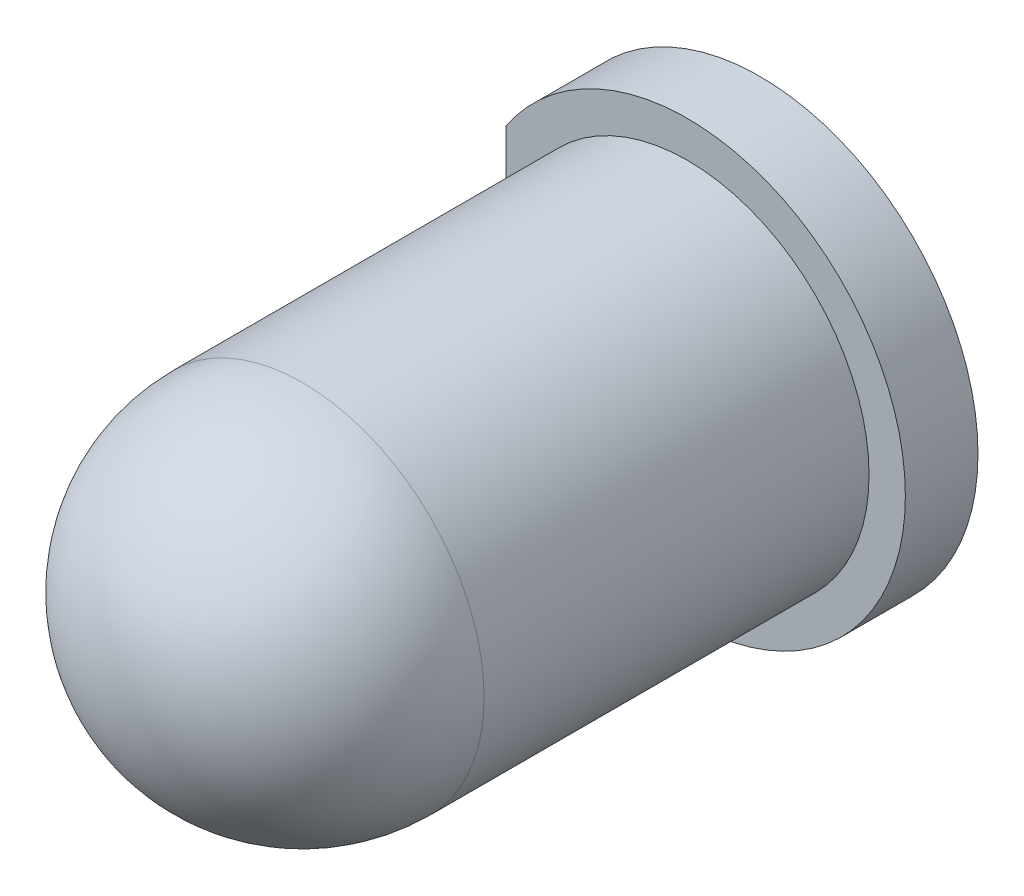
ISO-10303-21;
HEADER;
FILE_DESCRIPTION(('STEP AP214'),'2;1');
FILE_NAME('part.step','',(''),(''),'','','');
FILE_SCHEMA(('AUTOMOTIVE_DESIGN { 1 0 10303 214 1 1 1 1 }'));
ENDSEC;
DATA;
#1=APPLICATION_CONTEXT('core data for automotive mechanical design processes');
#2=APPLICATION_PROTOCOL_DEFINITION('international standard','automotive_design',2000,#1);
#3=PRODUCT_CONTEXT('',#1,'mechanical');
#4=PRODUCT('Part','Part','',(#3));
#5=PRODUCT_RELATED_PRODUCT_CATEGORY('part','',(#4));
#6=PRODUCT_DEFINITION_FORMATION('','',#4);
#7=PRODUCT_DEFINITION_CONTEXT('part definition',#1,'design');
#8=PRODUCT_DEFINITION('design','',#6,#7);
#9=PRODUCT_DEFINITION_SHAPE('','',#8);
#10=(LENGTH_UNIT() NAMED_UNIT(*) SI_UNIT(.MILLI.,.METRE.));
#11=(NAMED_UNIT(*) PLANE_ANGLE_UNIT() SI_UNIT($,.RADIAN.));
#12=(NAMED_UNIT(*) SI_UNIT($,.STERADIAN.) SOLID_ANGLE_UNIT());
#13=UNCERTAINTY_MEASURE_WITH_UNIT(LENGTH_MEASURE(1.E-05),#10,'distance_accuracy_value','');
#14=(GEOMETRIC_REPRESENTATION_CONTEXT(3) GLOBAL_UNCERTAINTY_ASSIGNED_CONTEXT((#13)) GLOBAL_UNIT_ASSIGNED_CONTEXT((#10,
#11,#12)) REPRESENTATION_CONTEXT('',''));
#15=CARTESIAN_POINT('',(0.,0.,0.));
#16=DIRECTION('',(0.,0.,1.));
#17=DIRECTION('',(1.,0.,0.));
#18=AXIS2_PLACEMENT_3D('',#15,#16,#17);
#19=CARTESIAN_POINT('',(0.,0.,1.));
#20=DIRECTION('',(0.,0.,-1.));
#21=DIRECTION('',(-1.,0.,0.));
#22=AXIS2_PLACEMENT_3D('',#19,#20,#21);
#23=CYLINDRICAL_SURFACE('',#22,3.);
#24=CARTESIAN_POINT('',(0.,0.,1.));
#25=DIRECTION('',(0.,0.,1.));
#26=DIRECTION('',(1.,0.,0.));
#27=AXIS2_PLACEMENT_3D('',#24,#25,#26);
#28=CIRCLE('',#27,3.);
#29=CARTESIAN_POINT('',(-2.5,-1.6583123951777,1.));
#30=VERTEX_POINT('',#29);
#31=CARTESIAN_POINT('',(-2.5,1.6583123951777,1.));
#32=VERTEX_POINT('',#31);
#33=EDGE_CURVE('E42',#30,#32,#28,.T.);
#34=ORIENTED_EDGE('',*,*,#33,.F.);
#35=DIRECTION('',(0.,0.,-1.));
#36=VECTOR('',#35,1.);
#37=CARTESIAN_POINT('',(-2.5,-1.6583123951777,4.35410196624969));
#38=LINE('',#37,#36);
#39=CARTESIAN_POINT('',(-2.5,-1.6583123951777,0.));
#40=VERTEX_POINT('',#39);
#41=EDGE_CURVE('E63',#30,#40,#38,.T.);
#42=ORIENTED_EDGE('',*,*,#41,.T.);
#43=CARTESIAN_POINT('',(0.,0.,0.));
#44=DIRECTION('',(0.,0.,1.));
#45=DIRECTION('',(1.,0.,0.));
#46=AXIS2_PLACEMENT_3D('',#43,#44,#45);
#47=CIRCLE('',#46,3.);
#48=CARTESIAN_POINT('',(-2.5,1.6583123951777,0.));
#49=VERTEX_POINT('',#48);
#50=EDGE_CURVE('E77',#40,#49,#47,.T.);
#51=ORIENTED_EDGE('',*,*,#50,.T.);
#52=DIRECTION('',(0.,0.,-1.));
#53=VECTOR('',#52,1.);
#54=CARTESIAN_POINT('',(-2.5,1.6583123951777,4.35410196624969));
#55=LINE('',#54,#53);
#56=EDGE_CURVE('E49',#32,#49,#55,.T.);
#57=ORIENTED_EDGE('',*,*,#56,.F.);
#58=EDGE_LOOP('',(#34,#42,#51,#57));
#59=FACE_BOUND('',#58,.T.);
#60=ADVANCED_FACE('F35',(#59),#23,.T.);
#61=CARTESIAN_POINT('',(0.,0.,1.));
#62=DIRECTION('',(0.,0.,1.));
#63=DIRECTION('',(1.,0.,0.));
#64=AXIS2_PLACEMENT_3D('',#61,#62,#63);
#65=PLANE('',#64);
#66=DIRECTION('',(0.,-1.,0.));
#67=VECTOR('',#66,1.);
#68=CARTESIAN_POINT('',(-2.5,1.6583123951777,1.));
#69=LINE('',#68,#67);
#70=CARTESIAN_POINT('',(-2.5,0.,1.));
#71=VERTEX_POINT('',#70);
#72=EDGE_CURVE('E55',#71,#30,#69,.T.);
#73=ORIENTED_EDGE('',*,*,#72,.T.);
#74=ORIENTED_EDGE('',*,*,#33,.T.);
#75=EDGE_CURVE('E70',#32,#71,#69,.T.);
#76=ORIENTED_EDGE('',*,*,#75,.T.);
#77=CARTESIAN_POINT('',(0.,0.,1.));
#78=DIRECTION('',(0.,0.,1.));
#79=DIRECTION('',(1.,0.,0.));
#80=AXIS2_PLACEMENT_3D('',#77,#78,#79);
#81=CIRCLE('',#80,2.5);
#82=EDGE_CURVE('E11',#71,#71,#81,.T.);
#83=ORIENTED_EDGE('',*,*,#82,.F.);
#84=EDGE_LOOP('',(#73,#74,#76,#83));
#85=FACE_BOUND('',#84,.T.);
#86=ADVANCED_FACE('F75',(#85),#65,.T.);
#87=CARTESIAN_POINT('',(0.,0.,0.));
#88=DIRECTION('',(0.,0.,1.));
#89=DIRECTION('',(1.,0.,0.));
#90=AXIS2_PLACEMENT_3D('',#87,#88,#89);
#91=PLANE('',#90);
#92=ORIENTED_EDGE('',*,*,#50,.F.);
#93=DIRECTION('',(0.,-1.,0.));
#94=VECTOR('',#93,1.);
#95=CARTESIAN_POINT('',(-2.5,1.6583123951777,0.));
#96=LINE('',#95,#94);
#97=EDGE_CURVE('E65',#49,#40,#96,.T.);
#98=ORIENTED_EDGE('',*,*,#97,.F.);
#99=EDGE_LOOP('',(#92,#98));
#100=FACE_BOUND('',#99,.T.);
#101=ADVANCED_FACE('F95',(#100),#91,.F.);
#102=CARTESIAN_POINT('',(0.,0.,6.3));
#103=DIRECTION('',(0.,0.,-1.));
#104=DIRECTION('',(0.,1.,0.));
#105=AXIS2_PLACEMENT_3D('',#102,#103,#104);
#106=SPHERICAL_SURFACE('',#105,2.5);
#107=CARTESIAN_POINT('',(0.,0.,6.3));
#108=DIRECTION('',(0.,0.,-1.));
#109=DIRECTION('',(0.,1.,0.));
#110=AXIS2_PLACEMENT_3D('',#107,#108,#109);
#111=CIRCLE('',#110,2.5);
#112=CARTESIAN_POINT('',(0.,2.5,6.3));
#113=VERTEX_POINT('',#112);
#114=EDGE_CURVE('E79',#113,#113,#111,.T.);
#115=ORIENTED_EDGE('',*,*,#114,.F.);
#116=EDGE_LOOP('',(#115));
#117=FACE_BOUND('',#116,.T.);
#118=ADVANCED_FACE('F87',(#117),#106,.T.);
#119=CARTESIAN_POINT('',(0.,0.,1.));
#120=DIRECTION('',(0.,0.,-1.));
#121=DIRECTION('',(0.,1.,0.));
#122=AXIS2_PLACEMENT_3D('',#119,#120,#121);
#123=CYLINDRICAL_SURFACE('',#122,2.5);
#124=ORIENTED_EDGE('',*,*,#114,.T.);
#125=EDGE_LOOP('',(#124));
#126=FACE_BOUND('',#125,.T.);
#127=ORIENTED_EDGE('',*,*,#82,.T.);
#128=EDGE_LOOP('',(#127));
#129=FACE_BOUND('',#128,.T.);
#130=ADVANCED_FACE('F85',(#126,#129),#123,.T.);
#131=CARTESIAN_POINT('',(-2.5,1.6583123951777,4.35410196624969));
#132=DIRECTION('',(1.,0.,0.));
#133=DIRECTION('',(0.,0.,-1.));
#134=AXIS2_PLACEMENT_3D('',#131,#132,#133);
#135=PLANE('',#134);
#136=ORIENTED_EDGE('',*,*,#56,.T.);
#137=ORIENTED_EDGE('',*,*,#97,.T.);
#138=ORIENTED_EDGE('',*,*,#41,.F.);
#139=ORIENTED_EDGE('',*,*,#72,.F.);
#140=ORIENTED_EDGE('',*,*,#75,.F.);
#141=EDGE_LOOP('',(#136,#137,#138,#139,#140));
#142=FACE_BOUND('',#141,.T.);
#143=ADVANCED_FACE('F64',(#142),#135,.F.);
#144=CLOSED_SHELL('',(#60,#86,#101,#118,#130,#143));
#145=MANIFOLD_SOLID_BREP('B2',#144);
#146=ADVANCED_BREP_SHAPE_REPRESENTATION('',(#18,#145),#14);
#147=SHAPE_DEFINITION_REPRESENTATION(#9,#146);
ENDSEC;
END-ISO-10303-21;
